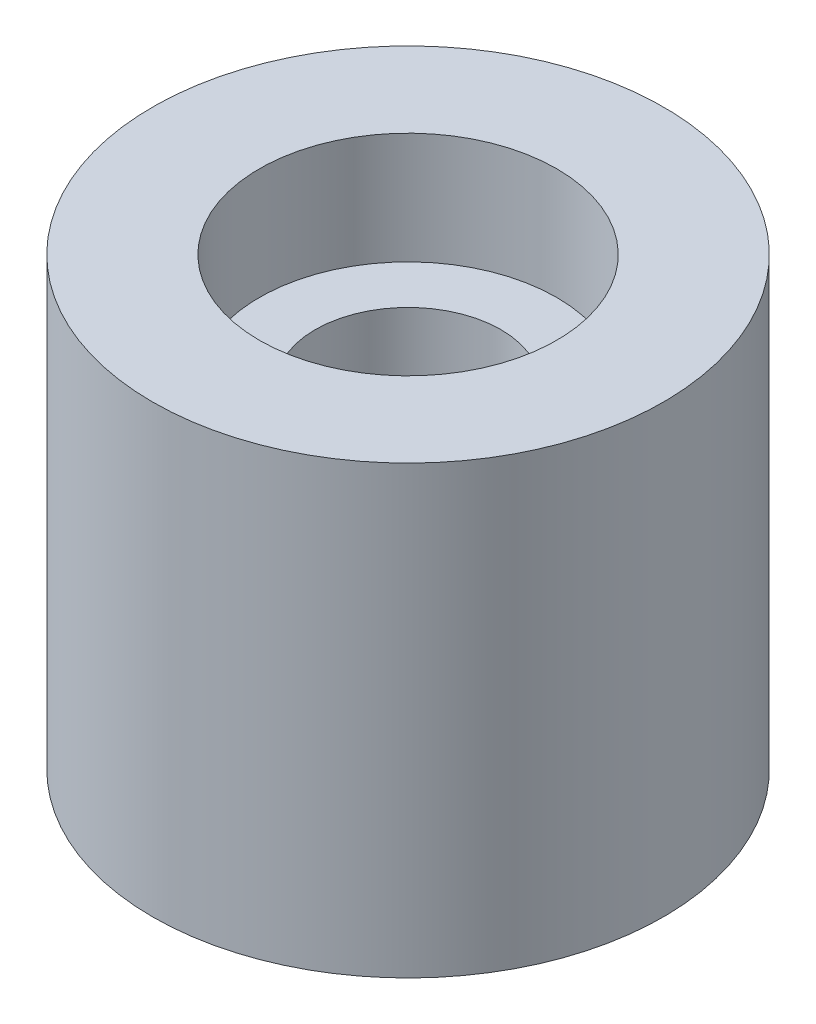
ISO-10303-21;
HEADER;
FILE_DESCRIPTION(('STEP AP214'),'2;1');
FILE_NAME('part.step','',(''),(''),'','','');
FILE_SCHEMA(('AUTOMOTIVE_DESIGN { 1 0 10303 214 1 1 1 1 }'));
ENDSEC;
DATA;
#1=APPLICATION_CONTEXT('core data for automotive mechanical design processes');
#2=APPLICATION_PROTOCOL_DEFINITION('international standard','automotive_design',2000,#1);
#3=PRODUCT_CONTEXT('',#1,'mechanical');
#4=PRODUCT('Part','Part','',(#3));
#5=PRODUCT_RELATED_PRODUCT_CATEGORY('part','',(#4));
#6=PRODUCT_DEFINITION_FORMATION('','',#4);
#7=PRODUCT_DEFINITION_CONTEXT('part definition',#1,'design');
#8=PRODUCT_DEFINITION('design','',#6,#7);
#9=PRODUCT_DEFINITION_SHAPE('','',#8);
#10=(LENGTH_UNIT() NAMED_UNIT(*) SI_UNIT(.MILLI.,.METRE.));
#11=(NAMED_UNIT(*) PLANE_ANGLE_UNIT() SI_UNIT($,.RADIAN.));
#12=(NAMED_UNIT(*) SI_UNIT($,.STERADIAN.) SOLID_ANGLE_UNIT());
#13=UNCERTAINTY_MEASURE_WITH_UNIT(LENGTH_MEASURE(1.E-05),#10,'distance_accuracy_value','');
#14=(GEOMETRIC_REPRESENTATION_CONTEXT(3) GLOBAL_UNCERTAINTY_ASSIGNED_CONTEXT((#13)) GLOBAL_UNIT_ASSIGNED_CONTEXT((#10,
#11,#12)) REPRESENTATION_CONTEXT('',''));
#15=CARTESIAN_POINT('',(0.,0.,0.));
#16=DIRECTION('',(0.,0.,1.));
#17=DIRECTION('',(1.,0.,0.));
#18=AXIS2_PLACEMENT_3D('',#15,#16,#17);
#19=CARTESIAN_POINT('',(0.,0.,0.));
#20=DIRECTION('',(0.,1.,0.));
#21=DIRECTION('',(0.,0.,1.));
#22=AXIS2_PLACEMENT_3D('',#19,#20,#21);
#23=CYLINDRICAL_SURFACE('',#22,1.);
#24=CARTESIAN_POINT('',(0.,1.2,0.));
#25=DIRECTION('',(0.,1.,0.));
#26=DIRECTION('',(0.,0.,1.));
#27=AXIS2_PLACEMENT_3D('',#24,#25,#26);
#28=CIRCLE('',#27,1.);
#29=CARTESIAN_POINT('',(0.,1.2,1.));
#30=VERTEX_POINT('',#29);
#31=EDGE_CURVE('E37',#30,#30,#28,.F.);
#32=ORIENTED_EDGE('',*,*,#31,.T.);
#33=EDGE_LOOP('',(#32));
#34=FACE_BOUND('',#33,.T.);
#35=CARTESIAN_POINT('',(0.,3.6,0.));
#36=DIRECTION('',(0.,1.,0.));
#37=DIRECTION('',(0.,0.,1.));
#38=AXIS2_PLACEMENT_3D('',#35,#36,#37);
#39=CIRCLE('',#38,1.);
#40=CARTESIAN_POINT('',(0.,3.6,1.));
#41=VERTEX_POINT('',#40);
#42=EDGE_CURVE('E46',#41,#41,#39,.F.);
#43=ORIENTED_EDGE('',*,*,#42,.F.);
#44=EDGE_LOOP('',(#43));
#45=FACE_BOUND('',#44,.T.);
#46=ADVANCED_FACE('F33',(#34,#45),#23,.F.);
#47=CARTESIAN_POINT('',(0.,4.8,0.));
#48=DIRECTION('',(0.,-1.,0.));
#49=DIRECTION('',(0.,0.,-1.));
#50=AXIS2_PLACEMENT_3D('',#47,#48,#49);
#51=CYLINDRICAL_SURFACE('',#50,2.75);
#52=CARTESIAN_POINT('',(0.,4.8,0.));
#53=DIRECTION('',(0.,1.,0.));
#54=DIRECTION('',(0.,0.,1.));
#55=AXIS2_PLACEMENT_3D('',#52,#53,#54);
#56=CIRCLE('',#55,2.75);
#57=CARTESIAN_POINT('',(0.,4.8,2.75));
#58=VERTEX_POINT('',#57);
#59=EDGE_CURVE('E10',#58,#58,#56,.T.);
#60=ORIENTED_EDGE('',*,*,#59,.F.);
#61=EDGE_LOOP('',(#60));
#62=FACE_BOUND('',#61,.T.);
#63=CARTESIAN_POINT('',(0.,0.,0.));
#64=DIRECTION('',(0.,1.,0.));
#65=DIRECTION('',(0.,0.,1.));
#66=AXIS2_PLACEMENT_3D('',#63,#64,#65);
#67=CIRCLE('',#66,2.75);
#68=CARTESIAN_POINT('',(0.,0.,2.75));
#69=VERTEX_POINT('',#68);
#70=EDGE_CURVE('E41',#69,#69,#67,.T.);
#71=ORIENTED_EDGE('',*,*,#70,.T.);
#72=EDGE_LOOP('',(#71));
#73=FACE_BOUND('',#72,.T.);
#74=ADVANCED_FACE('F35',(#62,#73),#51,.T.);
#75=CARTESIAN_POINT('',(0.,4.8,0.));
#76=DIRECTION('',(0.,1.,0.));
#77=DIRECTION('',(0.,0.,1.));
#78=AXIS2_PLACEMENT_3D('',#75,#76,#77);
#79=PLANE('',#78);
#80=CARTESIAN_POINT('',(0.,4.8,0.));
#81=DIRECTION('',(0.,1.,0.));
#82=DIRECTION('',(0.,0.,1.));
#83=AXIS2_PLACEMENT_3D('',#80,#81,#82);
#84=CIRCLE('',#83,1.6);
#85=CARTESIAN_POINT('',(0.,4.8,1.6));
#86=VERTEX_POINT('',#85);
#87=EDGE_CURVE('E49',#86,#86,#84,.T.);
#88=ORIENTED_EDGE('',*,*,#87,.F.);
#89=EDGE_LOOP('',(#88));
#90=FACE_BOUND('',#89,.T.);
#91=ORIENTED_EDGE('',*,*,#59,.T.);
#92=EDGE_LOOP('',(#91));
#93=FACE_BOUND('',#92,.T.);
#94=ADVANCED_FACE('F91',(#90,#93),#79,.T.);
#95=CARTESIAN_POINT('',(0.,0.,0.));
#96=DIRECTION('',(0.,1.,0.));
#97=DIRECTION('',(0.,0.,1.));
#98=AXIS2_PLACEMENT_3D('',#95,#96,#97);
#99=PLANE('',#98);
#100=CARTESIAN_POINT('',(0.,0.,0.));
#101=DIRECTION('',(0.,1.,0.));
#102=DIRECTION('',(0.,0.,1.));
#103=AXIS2_PLACEMENT_3D('',#100,#101,#102);
#104=CIRCLE('',#103,1.6);
#105=CARTESIAN_POINT('',(0.,0.,1.6));
#106=VERTEX_POINT('',#105);
#107=EDGE_CURVE('E60',#106,#106,#104,.T.);
#108=ORIENTED_EDGE('',*,*,#107,.T.);
#109=EDGE_LOOP('',(#108));
#110=FACE_BOUND('',#109,.T.);
#111=ORIENTED_EDGE('',*,*,#70,.F.);
#112=EDGE_LOOP('',(#111));
#113=FACE_BOUND('',#112,.T.);
#114=ADVANCED_FACE('F96',(#110,#113),#99,.F.);
#115=CARTESIAN_POINT('',(0.,3.6,0.));
#116=DIRECTION('',(0.,1.,0.));
#117=DIRECTION('',(0.,0.,1.));
#118=AXIS2_PLACEMENT_3D('',#115,#116,#117);
#119=PLANE('',#118);
#120=CARTESIAN_POINT('',(0.,3.6,0.));
#121=DIRECTION('',(0.,1.,0.));
#122=DIRECTION('',(0.,0.,1.));
#123=AXIS2_PLACEMENT_3D('',#120,#121,#122);
#124=CIRCLE('',#123,1.6);
#125=CARTESIAN_POINT('',(0.,3.6,1.6));
#126=VERTEX_POINT('',#125);
#127=EDGE_CURVE('E52',#126,#126,#124,.T.);
#128=ORIENTED_EDGE('',*,*,#127,.T.);
#129=EDGE_LOOP('',(#128));
#130=FACE_BOUND('',#129,.T.);
#131=ORIENTED_EDGE('',*,*,#42,.T.);
#132=EDGE_LOOP('',(#131));
#133=FACE_BOUND('',#132,.T.);
#134=ADVANCED_FACE('F83',(#130,#133),#119,.T.);
#135=CARTESIAN_POINT('',(0.,3.6,0.));
#136=DIRECTION('',(0.,1.,0.));
#137=DIRECTION('',(0.,0.,1.));
#138=AXIS2_PLACEMENT_3D('',#135,#136,#137);
#139=CYLINDRICAL_SURFACE('',#138,1.6);
#140=ORIENTED_EDGE('',*,*,#127,.F.);
#141=EDGE_LOOP('',(#140));
#142=FACE_BOUND('',#141,.T.);
#143=ORIENTED_EDGE('',*,*,#87,.T.);
#144=EDGE_LOOP('',(#143));
#145=FACE_BOUND('',#144,.T.);
#146=ADVANCED_FACE('F75',(#142,#145),#139,.F.);
#147=CARTESIAN_POINT('',(0.,1.2,0.));
#148=DIRECTION('',(0.,1.,0.));
#149=DIRECTION('',(0.,0.,1.));
#150=AXIS2_PLACEMENT_3D('',#147,#148,#149);
#151=PLANE('',#150);
#152=CARTESIAN_POINT('',(0.,1.2,0.));
#153=DIRECTION('',(0.,1.,0.));
#154=DIRECTION('',(0.,0.,1.));
#155=AXIS2_PLACEMENT_3D('',#152,#153,#154);
#156=CIRCLE('',#155,1.6);
#157=CARTESIAN_POINT('',(0.,1.2,1.6));
#158=VERTEX_POINT('',#157);
#159=EDGE_CURVE('E63',#158,#158,#156,.T.);
#160=ORIENTED_EDGE('',*,*,#159,.F.);
#161=EDGE_LOOP('',(#160));
#162=FACE_BOUND('',#161,.T.);
#163=ORIENTED_EDGE('',*,*,#31,.F.);
#164=EDGE_LOOP('',(#163));
#165=FACE_BOUND('',#164,.T.);
#166=ADVANCED_FACE('F72',(#162,#165),#151,.F.);
#167=CARTESIAN_POINT('',(0.,1.2,0.));
#168=DIRECTION('',(0.,-1.,0.));
#169=DIRECTION('',(0.,0.,-1.));
#170=AXIS2_PLACEMENT_3D('',#167,#168,#169);
#171=CYLINDRICAL_SURFACE('',#170,1.6);
#172=ORIENTED_EDGE('',*,*,#159,.T.);
#173=EDGE_LOOP('',(#172));
#174=FACE_BOUND('',#173,.T.);
#175=ORIENTED_EDGE('',*,*,#107,.F.);
#176=EDGE_LOOP('',(#175));
#177=FACE_BOUND('',#176,.T.);
#178=ADVANCED_FACE('F74',(#174,#177),#171,.F.);
#179=CLOSED_SHELL('',(#46,#74,#94,#114,#134,#146,#166,#178));
#180=MANIFOLD_SOLID_BREP('B2',#179);
#181=ADVANCED_BREP_SHAPE_REPRESENTATION('',(#18,#180),#14);
#182=SHAPE_DEFINITION_REPRESENTATION(#9,#181);
ENDSEC;
END-ISO-10303-21;
